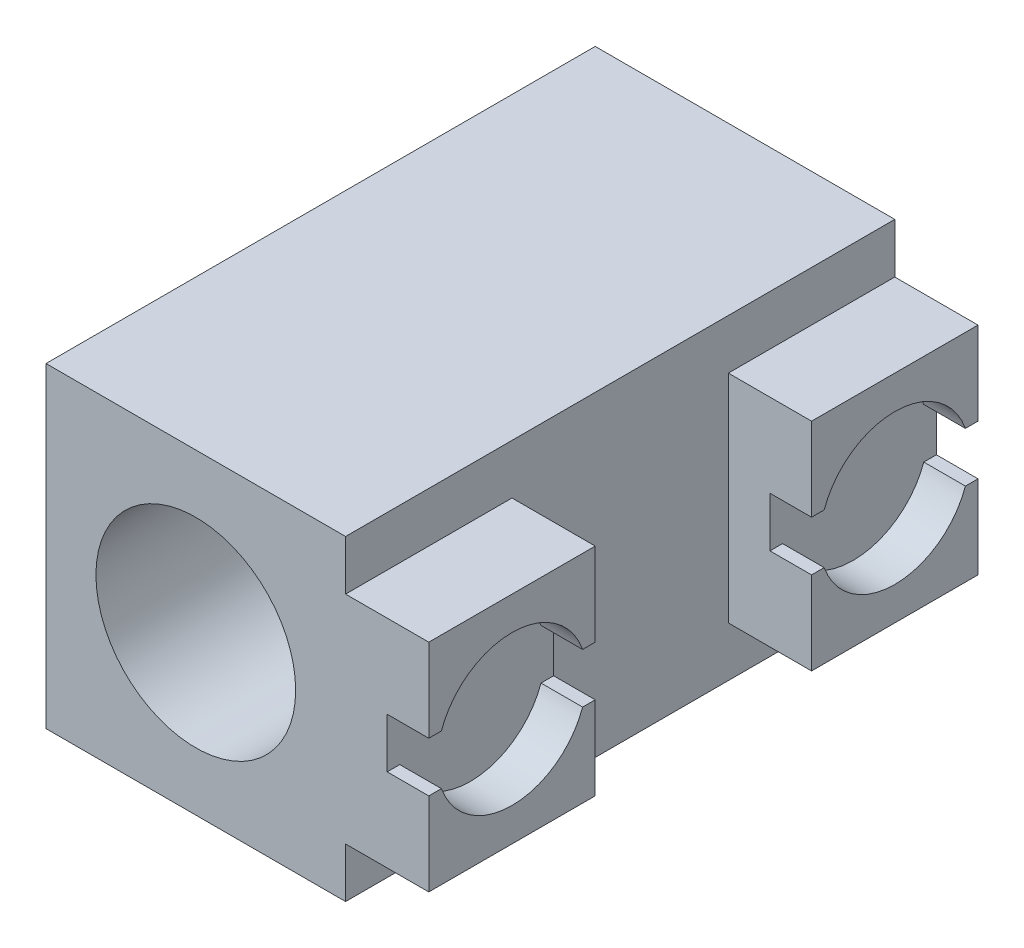
ISO-10303-21;
HEADER;
FILE_DESCRIPTION(('STEP AP214'),'2;1');
FILE_NAME('part.step','',(''),(''),'','','');
FILE_SCHEMA(('AUTOMOTIVE_DESIGN { 1 0 10303 214 1 1 1 1 }'));
ENDSEC;
DATA;
#1=APPLICATION_CONTEXT('core data for automotive mechanical design processes');
#2=APPLICATION_PROTOCOL_DEFINITION('international standard','automotive_design',2000,#1);
#3=PRODUCT_CONTEXT('',#1,'mechanical');
#4=PRODUCT('Part','Part','',(#3));
#5=PRODUCT_RELATED_PRODUCT_CATEGORY('part','',(#4));
#6=PRODUCT_DEFINITION_FORMATION('','',#4);
#7=PRODUCT_DEFINITION_CONTEXT('part definition',#1,'design');
#8=PRODUCT_DEFINITION('design','',#6,#7);
#9=PRODUCT_DEFINITION_SHAPE('','',#8);
#10=(LENGTH_UNIT() NAMED_UNIT(*) SI_UNIT(.MILLI.,.METRE.));
#11=(NAMED_UNIT(*) PLANE_ANGLE_UNIT() SI_UNIT($,.RADIAN.));
#12=(NAMED_UNIT(*) SI_UNIT($,.STERADIAN.) SOLID_ANGLE_UNIT());
#13=UNCERTAINTY_MEASURE_WITH_UNIT(LENGTH_MEASURE(1.E-05),#10,'distance_accuracy_value','');
#14=(GEOMETRIC_REPRESENTATION_CONTEXT(3) GLOBAL_UNCERTAINTY_ASSIGNED_CONTEXT((#13)) GLOBAL_UNIT_ASSIGNED_CONTEXT((#10,
#11,#12)) REPRESENTATION_CONTEXT('',''));
#15=CARTESIAN_POINT('',(0.,0.,0.));
#16=DIRECTION('',(0.,0.,1.));
#17=DIRECTION('',(1.,0.,0.));
#18=AXIS2_PLACEMENT_3D('',#15,#16,#17);
#19=CARTESIAN_POINT('',(46.,0.,0.));
#20=DIRECTION('',(-1.,0.,0.));
#21=DIRECTION('',(0.,-1.,0.));
#22=AXIS2_PLACEMENT_3D('',#19,#20,#21);
#23=PLANE('',#22);
#24=DIRECTION('',(0.,1.,0.));
#25=VECTOR('',#24,1.);
#26=CARTESIAN_POINT('',(46.,32.,13.));
#27=LINE('',#26,#25);
#28=CARTESIAN_POINT('',(46.,6.00000000000001,13.));
#29=VERTEX_POINT('',#28);
#30=CARTESIAN_POINT('',(46.,16.,13.));
#31=VERTEX_POINT('',#30);
#32=EDGE_CURVE('E265',#29,#31,#27,.T.);
#33=ORIENTED_EDGE('',*,*,#32,.T.);
#34=DIRECTION('',(0.,0.,1.));
#35=VECTOR('',#34,1.);
#36=CARTESIAN_POINT('',(46.,16.,-33.));
#37=LINE('',#36,#35);
#38=CARTESIAN_POINT('',(46.,16.,14.5147186257614));
#39=VERTEX_POINT('',#38);
#40=EDGE_CURVE('E508',#31,#39,#37,.T.);
#41=ORIENTED_EDGE('',*,*,#40,.T.);
#42=CARTESIAN_POINT('',(46.,19.,23.));
#43=DIRECTION('',(1.,0.,0.));
#44=DIRECTION('',(0.,1.,0.));
#45=AXIS2_PLACEMENT_3D('',#42,#43,#44);
#46=CIRCLE('',#45,9.);
#47=CARTESIAN_POINT('',(46.,16.,31.4852813742386));
#48=VERTEX_POINT('',#47);
#49=EDGE_CURVE('E476',#48,#39,#46,.T.);
#50=ORIENTED_EDGE('',*,*,#49,.F.);
#51=CARTESIAN_POINT('',(46.,16.,33.));
#52=VERTEX_POINT('',#51);
#53=EDGE_CURVE('E427',#48,#52,#37,.T.);
#54=ORIENTED_EDGE('',*,*,#53,.T.);
#55=DIRECTION('',(0.,-1.,0.));
#56=VECTOR('',#55,1.);
#57=CARTESIAN_POINT('',(46.,6.,33.));
#58=LINE('',#57,#56);
#59=CARTESIAN_POINT('',(46.,6.,33.));
#60=VERTEX_POINT('',#59);
#61=EDGE_CURVE('E262',#52,#60,#58,.T.);
#62=ORIENTED_EDGE('',*,*,#61,.T.);
#63=DIRECTION('',(0.,0.,-1.));
#64=VECTOR('',#63,1.);
#65=CARTESIAN_POINT('',(46.,6.00000000000001,13.));
#66=LINE('',#65,#64);
#67=EDGE_CURVE('E261',#60,#29,#66,.T.);
#68=ORIENTED_EDGE('',*,*,#67,.T.);
#69=EDGE_LOOP('',(#33,#41,#50,#54,#62,#68));
#70=FACE_BOUND('',#69,.T.);
#71=ADVANCED_FACE('F37',(#70),#23,.F.);
#72=CARTESIAN_POINT('',(46.,0.,0.));
#73=DIRECTION('',(1.,0.,0.));
#74=DIRECTION('',(0.,1.,0.));
#75=AXIS2_PLACEMENT_3D('',#72,#73,#74);
#76=PLANE('',#75);
#77=CARTESIAN_POINT('',(46.,16.,-14.5147186257614));
#78=VERTEX_POINT('',#77);
#79=CARTESIAN_POINT('',(46.,16.,-13.));
#80=VERTEX_POINT('',#79);
#81=EDGE_CURVE('E363',#78,#80,#37,.T.);
#82=ORIENTED_EDGE('',*,*,#81,.T.);
#83=DIRECTION('',(0.,-1.,0.));
#84=VECTOR('',#83,1.);
#85=CARTESIAN_POINT('',(46.,32.,-13.));
#86=LINE('',#85,#84);
#87=CARTESIAN_POINT('',(46.,6.00000000000001,-13.));
#88=VERTEX_POINT('',#87);
#89=EDGE_CURVE('E343',#80,#88,#86,.T.);
#90=ORIENTED_EDGE('',*,*,#89,.T.);
#91=DIRECTION('',(0.,0.,-1.));
#92=VECTOR('',#91,1.);
#93=CARTESIAN_POINT('',(46.,6.00000000000001,-13.));
#94=LINE('',#93,#92);
#95=CARTESIAN_POINT('',(46.,6.00000000000001,-33.));
#96=VERTEX_POINT('',#95);
#97=EDGE_CURVE('E340',#88,#96,#94,.T.);
#98=ORIENTED_EDGE('',*,*,#97,.T.);
#99=DIRECTION('',(0.,1.,0.));
#100=VECTOR('',#99,1.);
#101=CARTESIAN_POINT('',(46.,6.00000000000001,-33.));
#102=LINE('',#101,#100);
#103=CARTESIAN_POINT('',(46.,16.,-33.));
#104=VERTEX_POINT('',#103);
#105=EDGE_CURVE('E249',#96,#104,#102,.T.);
#106=ORIENTED_EDGE('',*,*,#105,.T.);
#107=CARTESIAN_POINT('',(46.,16.,-31.4852813742386));
#108=VERTEX_POINT('',#107);
#109=EDGE_CURVE('E423',#104,#108,#37,.T.);
#110=ORIENTED_EDGE('',*,*,#109,.T.);
#111=CARTESIAN_POINT('',(46.,19.,-23.));
#112=DIRECTION('',(1.,0.,0.));
#113=DIRECTION('',(0.,1.,0.));
#114=AXIS2_PLACEMENT_3D('',#111,#112,#113);
#115=CIRCLE('',#114,9.);
#116=EDGE_CURVE('E479',#78,#108,#115,.T.);
#117=ORIENTED_EDGE('',*,*,#116,.F.);
#118=EDGE_LOOP('',(#82,#90,#98,#106,#110,#117));
#119=FACE_BOUND('',#118,.T.);
#120=ADVANCED_FACE('F361',(#119),#76,.T.);
#121=CARTESIAN_POINT('',(41.,19.,-23.));
#122=DIRECTION('',(1.,0.,0.));
#123=DIRECTION('',(0.,1.,0.));
#124=AXIS2_PLACEMENT_3D('',#121,#122,#123);
#125=CYLINDRICAL_SURFACE('',#124,9.);
#126=ORIENTED_EDGE('',*,*,#116,.T.);
#127=DIRECTION('',(1.,0.,0.));
#128=VECTOR('',#127,1.);
#129=CARTESIAN_POINT('',(41.,16.,-31.4852813742386));
#130=LINE('',#129,#128);
#131=CARTESIAN_POINT('',(41.,16.,-31.4852813742386));
#132=VERTEX_POINT('',#131);
#133=EDGE_CURVE('E457',#108,#132,#130,.F.);
#134=ORIENTED_EDGE('',*,*,#133,.T.);
#135=CARTESIAN_POINT('',(41.,19.,-23.));
#136=DIRECTION('',(1.,0.,0.));
#137=DIRECTION('',(0.,1.,0.));
#138=AXIS2_PLACEMENT_3D('',#135,#136,#137);
#139=CIRCLE('',#138,9.);
#140=CARTESIAN_POINT('',(41.,16.,-14.5147186257614));
#141=VERTEX_POINT('',#140);
#142=EDGE_CURVE('E481',#141,#132,#139,.T.);
#143=ORIENTED_EDGE('',*,*,#142,.F.);
#144=DIRECTION('',(1.,0.,0.));
#145=VECTOR('',#144,1.);
#146=CARTESIAN_POINT('',(41.,16.,-14.5147186257614));
#147=LINE('',#146,#145);
#148=EDGE_CURVE('E454',#141,#78,#147,.T.);
#149=ORIENTED_EDGE('',*,*,#148,.T.);
#150=EDGE_LOOP('',(#126,#134,#143,#149));
#151=FACE_BOUND('',#150,.T.);
#152=ADVANCED_FACE('F386',(#151),#125,.F.);
#153=CARTESIAN_POINT('',(41.,19.,23.));
#154=DIRECTION('',(1.,0.,0.));
#155=DIRECTION('',(0.,1.,0.));
#156=AXIS2_PLACEMENT_3D('',#153,#154,#155);
#157=CYLINDRICAL_SURFACE('',#156,9.);
#158=ORIENTED_EDGE('',*,*,#49,.T.);
#159=DIRECTION('',(1.,0.,0.));
#160=VECTOR('',#159,1.);
#161=CARTESIAN_POINT('',(41.,16.,14.5147186257614));
#162=LINE('',#161,#160);
#163=CARTESIAN_POINT('',(41.,16.,14.5147186257614));
#164=VERTEX_POINT('',#163);
#165=EDGE_CURVE('E451',#39,#164,#162,.F.);
#166=ORIENTED_EDGE('',*,*,#165,.T.);
#167=CARTESIAN_POINT('',(41.,19.,23.));
#168=DIRECTION('',(1.,0.,0.));
#169=DIRECTION('',(0.,1.,0.));
#170=AXIS2_PLACEMENT_3D('',#167,#168,#169);
#171=CIRCLE('',#170,9.);
#172=CARTESIAN_POINT('',(41.,16.,31.4852813742386));
#173=VERTEX_POINT('',#172);
#174=EDGE_CURVE('E475',#173,#164,#171,.T.);
#175=ORIENTED_EDGE('',*,*,#174,.F.);
#176=DIRECTION('',(1.,0.,0.));
#177=VECTOR('',#176,1.);
#178=CARTESIAN_POINT('',(41.,16.,31.4852813742386));
#179=LINE('',#178,#177);
#180=EDGE_CURVE('E448',#173,#48,#179,.T.);
#181=ORIENTED_EDGE('',*,*,#180,.T.);
#182=EDGE_LOOP('',(#158,#166,#175,#181));
#183=FACE_BOUND('',#182,.T.);
#184=ADVANCED_FACE('F511',(#183),#157,.F.);
#185=CARTESIAN_POINT('',(36.,0.,33.));
#186=DIRECTION('',(-1.,0.,0.));
#187=DIRECTION('',(0.,-1.,0.));
#188=AXIS2_PLACEMENT_3D('',#185,#186,#187);
#189=PLANE('',#188);
#190=DIRECTION('',(0.,0.,1.));
#191=VECTOR('',#190,1.);
#192=CARTESIAN_POINT('',(36.,32.,-33.));
#193=LINE('',#192,#191);
#194=CARTESIAN_POINT('',(36.,32.,-33.));
#195=VERTEX_POINT('',#194);
#196=CARTESIAN_POINT('',(36.,32.,-13.));
#197=VERTEX_POINT('',#196);
#198=EDGE_CURVE('E275',#195,#197,#193,.T.);
#199=ORIENTED_EDGE('',*,*,#198,.F.);
#200=DIRECTION('',(0.,1.,0.));
#201=VECTOR('',#200,1.);
#202=CARTESIAN_POINT('',(36.,0.,-33.));
#203=LINE('',#202,#201);
#204=CARTESIAN_POINT('',(36.,38.,-33.));
#205=VERTEX_POINT('',#204);
#206=EDGE_CURVE('E316',#195,#205,#203,.T.);
#207=ORIENTED_EDGE('',*,*,#206,.T.);
#208=DIRECTION('',(0.,0.,-1.));
#209=VECTOR('',#208,1.);
#210=CARTESIAN_POINT('',(36.,38.,33.));
#211=LINE('',#210,#209);
#212=CARTESIAN_POINT('',(36.,38.,33.));
#213=VERTEX_POINT('',#212);
#214=EDGE_CURVE('E322',#213,#205,#211,.T.);
#215=ORIENTED_EDGE('',*,*,#214,.F.);
#216=DIRECTION('',(0.,1.,0.));
#217=VECTOR('',#216,1.);
#218=CARTESIAN_POINT('',(36.,0.,33.));
#219=LINE('',#218,#217);
#220=CARTESIAN_POINT('',(36.,32.,33.));
#221=VERTEX_POINT('',#220);
#222=EDGE_CURVE('E305',#221,#213,#219,.T.);
#223=ORIENTED_EDGE('',*,*,#222,.F.);
#224=DIRECTION('',(0.,0.,1.));
#225=VECTOR('',#224,1.);
#226=CARTESIAN_POINT('',(36.,32.,33.));
#227=LINE('',#226,#225);
#228=CARTESIAN_POINT('',(36.,32.,13.));
#229=VERTEX_POINT('',#228);
#230=EDGE_CURVE('E278',#229,#221,#227,.T.);
#231=ORIENTED_EDGE('',*,*,#230,.F.);
#232=DIRECTION('',(0.,1.,0.));
#233=VECTOR('',#232,1.);
#234=CARTESIAN_POINT('',(36.,32.,13.));
#235=LINE('',#234,#233);
#236=CARTESIAN_POINT('',(36.,6.00000000000001,13.));
#237=VERTEX_POINT('',#236);
#238=EDGE_CURVE('E274',#237,#229,#235,.T.);
#239=ORIENTED_EDGE('',*,*,#238,.F.);
#240=DIRECTION('',(0.,0.,-1.));
#241=VECTOR('',#240,1.);
#242=CARTESIAN_POINT('',(36.,6.00000000000001,13.));
#243=LINE('',#242,#241);
#244=CARTESIAN_POINT('',(36.,6.,33.));
#245=VERTEX_POINT('',#244);
#246=EDGE_CURVE('E271',#245,#237,#243,.T.);
#247=ORIENTED_EDGE('',*,*,#246,.F.);
#248=CARTESIAN_POINT('',(36.,0.,33.));
#249=VERTEX_POINT('',#248);
#250=EDGE_CURVE('E306',#249,#245,#219,.T.);
#251=ORIENTED_EDGE('',*,*,#250,.F.);
#252=DIRECTION('',(0.,0.,-1.));
#253=VECTOR('',#252,1.);
#254=CARTESIAN_POINT('',(36.,0.,33.));
#255=LINE('',#254,#253);
#256=CARTESIAN_POINT('',(36.,0.,-33.));
#257=VERTEX_POINT('',#256);
#258=EDGE_CURVE('E45',#249,#257,#255,.T.);
#259=ORIENTED_EDGE('',*,*,#258,.T.);
#260=CARTESIAN_POINT('',(36.,6.00000000000001,-33.));
#261=VERTEX_POINT('',#260);
#262=EDGE_CURVE('E317',#257,#261,#203,.T.);
#263=ORIENTED_EDGE('',*,*,#262,.T.);
#264=DIRECTION('',(0.,0.,-1.));
#265=VECTOR('',#264,1.);
#266=CARTESIAN_POINT('',(36.,6.00000000000001,-13.));
#267=LINE('',#266,#265);
#268=CARTESIAN_POINT('',(36.,6.00000000000001,-13.));
#269=VERTEX_POINT('',#268);
#270=EDGE_CURVE('E253',#269,#261,#267,.T.);
#271=ORIENTED_EDGE('',*,*,#270,.F.);
#272=DIRECTION('',(0.,-1.,0.));
#273=VECTOR('',#272,1.);
#274=CARTESIAN_POINT('',(36.,32.,-13.));
#275=LINE('',#274,#273);
#276=EDGE_CURVE('E351',#197,#269,#275,.T.);
#277=ORIENTED_EDGE('',*,*,#276,.F.);
#278=EDGE_LOOP('',(#199,#207,#215,#223,#231,#239,#247,#251,#259,#263,#271,#277));
#279=FACE_BOUND('',#278,.T.);
#280=ADVANCED_FACE('F330',(#279),#189,.F.);
#281=CARTESIAN_POINT('',(0.,0.,33.));
#282=DIRECTION('',(1.,0.,0.));
#283=DIRECTION('',(0.,0.,-1.));
#284=AXIS2_PLACEMENT_3D('',#281,#282,#283);
#285=PLANE('',#284);
#286=DIRECTION('',(0.,-1.,0.));
#287=VECTOR('',#286,1.);
#288=CARTESIAN_POINT('',(0.,0.,-33.));
#289=LINE('',#288,#287);
#290=CARTESIAN_POINT('',(0.,38.,-33.));
#291=VERTEX_POINT('',#290);
#292=CARTESIAN_POINT('',(0.,0.,-33.));
#293=VERTEX_POINT('',#292);
#294=EDGE_CURVE('E296',#291,#293,#289,.T.);
#295=ORIENTED_EDGE('',*,*,#294,.T.);
#296=DIRECTION('',(0.,0.,-1.));
#297=VECTOR('',#296,1.);
#298=CARTESIAN_POINT('',(0.,0.,33.));
#299=LINE('',#298,#297);
#300=CARTESIAN_POINT('',(0.,0.,33.));
#301=VERTEX_POINT('',#300);
#302=EDGE_CURVE('E11',#301,#293,#299,.T.);
#303=ORIENTED_EDGE('',*,*,#302,.F.);
#304=DIRECTION('',(0.,-1.,0.));
#305=VECTOR('',#304,1.);
#306=CARTESIAN_POINT('',(0.,0.,33.));
#307=LINE('',#306,#305);
#308=CARTESIAN_POINT('',(0.,38.,33.));
#309=VERTEX_POINT('',#308);
#310=EDGE_CURVE('E299',#309,#301,#307,.T.);
#311=ORIENTED_EDGE('',*,*,#310,.F.);
#312=DIRECTION('',(0.,0.,-1.));
#313=VECTOR('',#312,1.);
#314=CARTESIAN_POINT('',(0.,38.,33.));
#315=LINE('',#314,#313);
#316=EDGE_CURVE('E311',#309,#291,#315,.T.);
#317=ORIENTED_EDGE('',*,*,#316,.T.);
#318=EDGE_LOOP('',(#295,#303,#311,#317));
#319=FACE_BOUND('',#318,.T.);
#320=ADVANCED_FACE('F39',(#319),#285,.F.);
#321=CARTESIAN_POINT('',(0.,0.,33.));
#322=DIRECTION('',(0.,1.,0.));
#323=DIRECTION('',(0.,0.,1.));
#324=AXIS2_PLACEMENT_3D('',#321,#322,#323);
#325=PLANE('',#324);
#326=DIRECTION('',(1.,0.,0.));
#327=VECTOR('',#326,1.);
#328=CARTESIAN_POINT('',(0.,0.,-33.));
#329=LINE('',#328,#327);
#330=EDGE_CURVE('E314',#293,#257,#329,.T.);
#331=ORIENTED_EDGE('',*,*,#330,.T.);
#332=ORIENTED_EDGE('',*,*,#258,.F.);
#333=DIRECTION('',(1.,0.,0.));
#334=VECTOR('',#333,1.);
#335=CARTESIAN_POINT('',(0.,0.,33.));
#336=LINE('',#335,#334);
#337=EDGE_CURVE('E302',#301,#249,#336,.T.);
#338=ORIENTED_EDGE('',*,*,#337,.F.);
#339=ORIENTED_EDGE('',*,*,#302,.T.);
#340=EDGE_LOOP('',(#331,#332,#338,#339));
#341=FACE_BOUND('',#340,.T.);
#342=ADVANCED_FACE('F770',(#341),#325,.F.);
#343=CARTESIAN_POINT('',(0.,38.,33.));
#344=DIRECTION('',(0.,-1.,0.));
#345=DIRECTION('',(0.,0.,-1.));
#346=AXIS2_PLACEMENT_3D('',#343,#344,#345);
#347=PLANE('',#346);
#348=DIRECTION('',(-1.,0.,0.));
#349=VECTOR('',#348,1.);
#350=CARTESIAN_POINT('',(0.,38.,-33.));
#351=LINE('',#350,#349);
#352=EDGE_CURVE('E303',#205,#291,#351,.T.);
#353=ORIENTED_EDGE('',*,*,#352,.T.);
#354=ORIENTED_EDGE('',*,*,#316,.F.);
#355=DIRECTION('',(-1.,0.,0.));
#356=VECTOR('',#355,1.);
#357=CARTESIAN_POINT('',(0.,38.,33.));
#358=LINE('',#357,#356);
#359=EDGE_CURVE('E309',#213,#309,#358,.T.);
#360=ORIENTED_EDGE('',*,*,#359,.F.);
#361=ORIENTED_EDGE('',*,*,#214,.T.);
#362=EDGE_LOOP('',(#353,#354,#360,#361));
#363=FACE_BOUND('',#362,.T.);
#364=ADVANCED_FACE('F489',(#363),#347,.F.);
#365=CARTESIAN_POINT('',(0.,0.,33.));
#366=DIRECTION('',(0.,0.,-1.));
#367=DIRECTION('',(-1.,0.,0.));
#368=AXIS2_PLACEMENT_3D('',#365,#366,#367);
#369=PLANE('',#368);
#370=CARTESIAN_POINT('',(18.,19.,33.));
#371=DIRECTION('',(0.,0.,1.));
#372=DIRECTION('',(1.,0.,0.));
#373=AXIS2_PLACEMENT_3D('',#370,#371,#372);
#374=CIRCLE('',#373,12.);
#375=CARTESIAN_POINT('',(30.,19.,33.));
#376=VERTEX_POINT('',#375);
#377=EDGE_CURVE('E292',#376,#376,#374,.T.);
#378=ORIENTED_EDGE('',*,*,#377,.F.);
#379=EDGE_LOOP('',(#378));
#380=FACE_BOUND('',#379,.T.);
#381=ORIENTED_EDGE('',*,*,#61,.F.);
#382=DIRECTION('',(1.,0.,0.));
#383=VECTOR('',#382,1.);
#384=CARTESIAN_POINT('',(41.,16.,33.));
#385=LINE('',#384,#383);
#386=CARTESIAN_POINT('',(41.,16.,33.));
#387=VERTEX_POINT('',#386);
#388=EDGE_CURVE('E229',#387,#52,#385,.T.);
#389=ORIENTED_EDGE('',*,*,#388,.F.);
#390=DIRECTION('',(0.,-1.,0.));
#391=VECTOR('',#390,1.);
#392=CARTESIAN_POINT('',(41.,22.,33.));
#393=LINE('',#392,#391);
#394=CARTESIAN_POINT('',(41.,22.,33.));
#395=VERTEX_POINT('',#394);
#396=EDGE_CURVE('E414',#395,#387,#393,.T.);
#397=ORIENTED_EDGE('',*,*,#396,.F.);
#398=DIRECTION('',(-1.,0.,0.));
#399=VECTOR('',#398,1.);
#400=CARTESIAN_POINT('',(46.,22.,33.));
#401=LINE('',#400,#399);
#402=CARTESIAN_POINT('',(46.,22.,33.));
#403=VERTEX_POINT('',#402);
#404=EDGE_CURVE('E411',#403,#395,#401,.T.);
#405=ORIENTED_EDGE('',*,*,#404,.F.);
#406=CARTESIAN_POINT('',(46.,32.,33.));
#407=VERTEX_POINT('',#406);
#408=EDGE_CURVE('E258',#407,#403,#58,.T.);
#409=ORIENTED_EDGE('',*,*,#408,.F.);
#410=DIRECTION('',(-1.,0.,0.));
#411=VECTOR('',#410,1.);
#412=CARTESIAN_POINT('',(46.,32.,33.));
#413=LINE('',#412,#411);
#414=EDGE_CURVE('E270',#407,#221,#413,.T.);
#415=ORIENTED_EDGE('',*,*,#414,.T.);
#416=ORIENTED_EDGE('',*,*,#222,.T.);
#417=ORIENTED_EDGE('',*,*,#359,.T.);
#418=ORIENTED_EDGE('',*,*,#310,.T.);
#419=ORIENTED_EDGE('',*,*,#337,.T.);
#420=ORIENTED_EDGE('',*,*,#250,.T.);
#421=DIRECTION('',(-1.,0.,0.));
#422=VECTOR('',#421,1.);
#423=CARTESIAN_POINT('',(46.,6.,33.));
#424=LINE('',#423,#422);
#425=EDGE_CURVE('E289',#60,#245,#424,.T.);
#426=ORIENTED_EDGE('',*,*,#425,.F.);
#427=EDGE_LOOP('',(#381,#389,#397,#405,#409,#415,#416,#417,#418,#419,#420,#426));
#428=FACE_BOUND('',#427,.T.);
#429=ADVANCED_FACE('F408',(#380,#428),#369,.F.);
#430=CARTESIAN_POINT('',(0.,0.,-33.));
#431=DIRECTION('',(0.,0.,-1.));
#432=DIRECTION('',(-1.,0.,0.));
#433=AXIS2_PLACEMENT_3D('',#430,#431,#432);
#434=PLANE('',#433);
#435=DIRECTION('',(1.,0.,0.));
#436=VECTOR('',#435,1.);
#437=CARTESIAN_POINT('',(41.,16.,-33.));
#438=LINE('',#437,#436);
#439=CARTESIAN_POINT('',(41.,16.,-33.));
#440=VERTEX_POINT('',#439);
#441=EDGE_CURVE('E419',#440,#104,#438,.T.);
#442=ORIENTED_EDGE('',*,*,#441,.T.);
#443=ORIENTED_EDGE('',*,*,#105,.F.);
#444=DIRECTION('',(-1.,0.,0.));
#445=VECTOR('',#444,1.);
#446=CARTESIAN_POINT('',(46.,6.00000000000001,-33.));
#447=LINE('',#446,#445);
#448=EDGE_CURVE('E337',#96,#261,#447,.T.);
#449=ORIENTED_EDGE('',*,*,#448,.T.);
#450=ORIENTED_EDGE('',*,*,#262,.F.);
#451=ORIENTED_EDGE('',*,*,#330,.F.);
#452=ORIENTED_EDGE('',*,*,#294,.F.);
#453=ORIENTED_EDGE('',*,*,#352,.F.);
#454=ORIENTED_EDGE('',*,*,#206,.F.);
#455=DIRECTION('',(-1.,0.,0.));
#456=VECTOR('',#455,1.);
#457=CARTESIAN_POINT('',(46.,32.,-33.));
#458=LINE('',#457,#456);
#459=CARTESIAN_POINT('',(46.,32.,-33.));
#460=VERTEX_POINT('',#459);
#461=EDGE_CURVE('E248',#460,#195,#458,.T.);
#462=ORIENTED_EDGE('',*,*,#461,.F.);
#463=CARTESIAN_POINT('',(46.,22.,-33.));
#464=VERTEX_POINT('',#463);
#465=EDGE_CURVE('E234',#464,#460,#102,.T.);
#466=ORIENTED_EDGE('',*,*,#465,.F.);
#467=DIRECTION('',(-1.,0.,0.));
#468=VECTOR('',#467,1.);
#469=CARTESIAN_POINT('',(46.,22.,-33.));
#470=LINE('',#469,#468);
#471=CARTESIAN_POINT('',(41.,22.,-33.));
#472=VERTEX_POINT('',#471);
#473=EDGE_CURVE('E220',#464,#472,#470,.T.);
#474=ORIENTED_EDGE('',*,*,#473,.T.);
#475=DIRECTION('',(0.,-1.,0.));
#476=VECTOR('',#475,1.);
#477=CARTESIAN_POINT('',(41.,22.,-33.));
#478=LINE('',#477,#476);
#479=EDGE_CURVE('E228',#472,#440,#478,.T.);
#480=ORIENTED_EDGE('',*,*,#479,.T.);
#481=EDGE_LOOP('',(#442,#443,#449,#450,#451,#452,#453,#454,#462,#466,#474,#480));
#482=FACE_BOUND('',#481,.T.);
#483=CARTESIAN_POINT('',(18.,19.,-33.));
#484=DIRECTION('',(0.,0.,1.));
#485=DIRECTION('',(1.,0.,0.));
#486=AXIS2_PLACEMENT_3D('',#483,#484,#485);
#487=CIRCLE('',#486,12.);
#488=CARTESIAN_POINT('',(30.,19.,-33.));
#489=VERTEX_POINT('',#488);
#490=EDGE_CURVE('E293',#489,#489,#487,.T.);
#491=ORIENTED_EDGE('',*,*,#490,.T.);
#492=EDGE_LOOP('',(#491));
#493=FACE_BOUND('',#492,.T.);
#494=ADVANCED_FACE('F245',(#482,#493),#434,.T.);
#495=CARTESIAN_POINT('',(18.,19.,-33.));
#496=DIRECTION('',(0.,0.,1.));
#497=DIRECTION('',(1.,0.,0.));
#498=AXIS2_PLACEMENT_3D('',#495,#496,#497);
#499=CYLINDRICAL_SURFACE('',#498,12.);
#500=ORIENTED_EDGE('',*,*,#490,.F.);
#501=EDGE_LOOP('',(#500));
#502=FACE_BOUND('',#501,.T.);
#503=ORIENTED_EDGE('',*,*,#377,.T.);
#504=EDGE_LOOP('',(#503));
#505=FACE_BOUND('',#504,.T.);
#506=ADVANCED_FACE('F727',(#502,#505),#499,.F.);
#507=CARTESIAN_POINT('',(46.,6.00000000000001,13.));
#508=DIRECTION('',(0.,1.,0.));
#509=DIRECTION('',(0.,0.,1.));
#510=AXIS2_PLACEMENT_3D('',#507,#508,#509);
#511=PLANE('',#510);
#512=ORIENTED_EDGE('',*,*,#246,.T.);
#513=DIRECTION('',(-1.,0.,0.));
#514=VECTOR('',#513,1.);
#515=CARTESIAN_POINT('',(46.,6.00000000000001,13.));
#516=LINE('',#515,#514);
#517=EDGE_CURVE('E286',#29,#237,#516,.T.);
#518=ORIENTED_EDGE('',*,*,#517,.F.);
#519=ORIENTED_EDGE('',*,*,#67,.F.);
#520=ORIENTED_EDGE('',*,*,#425,.T.);
#521=EDGE_LOOP('',(#512,#518,#519,#520));
#522=FACE_BOUND('',#521,.T.);
#523=ADVANCED_FACE('F500',(#522),#511,.F.);
#524=CARTESIAN_POINT('',(46.,32.,13.));
#525=DIRECTION('',(0.,0.,1.));
#526=DIRECTION('',(0.,-1.,0.));
#527=AXIS2_PLACEMENT_3D('',#524,#525,#526);
#528=PLANE('',#527);
#529=DIRECTION('',(0.,-1.,0.));
#530=VECTOR('',#529,1.);
#531=CARTESIAN_POINT('',(41.,32.,13.));
#532=LINE('',#531,#530);
#533=CARTESIAN_POINT('',(41.,22.,13.));
#534=VERTEX_POINT('',#533);
#535=CARTESIAN_POINT('',(41.,16.,13.));
#536=VERTEX_POINT('',#535);
#537=EDGE_CURVE('E468',#534,#536,#532,.T.);
#538=ORIENTED_EDGE('',*,*,#537,.T.);
#539=DIRECTION('',(1.,0.,0.));
#540=VECTOR('',#539,1.);
#541=CARTESIAN_POINT('',(46.,16.,13.));
#542=LINE('',#541,#540);
#543=EDGE_CURVE('E462',#536,#31,#542,.T.);
#544=ORIENTED_EDGE('',*,*,#543,.T.);
#545=ORIENTED_EDGE('',*,*,#32,.F.);
#546=ORIENTED_EDGE('',*,*,#517,.T.);
#547=ORIENTED_EDGE('',*,*,#238,.T.);
#548=DIRECTION('',(-1.,0.,0.));
#549=VECTOR('',#548,1.);
#550=CARTESIAN_POINT('',(46.,32.,13.));
#551=LINE('',#550,#549);
#552=CARTESIAN_POINT('',(46.,32.,13.));
#553=VERTEX_POINT('',#552);
#554=EDGE_CURVE('E283',#553,#229,#551,.T.);
#555=ORIENTED_EDGE('',*,*,#554,.F.);
#556=CARTESIAN_POINT('',(46.,22.,13.));
#557=VERTEX_POINT('',#556);
#558=EDGE_CURVE('E264',#557,#553,#27,.T.);
#559=ORIENTED_EDGE('',*,*,#558,.F.);
#560=DIRECTION('',(-1.,0.,0.));
#561=VECTOR('',#560,1.);
#562=CARTESIAN_POINT('',(46.,22.,13.));
#563=LINE('',#562,#561);
#564=EDGE_CURVE('E445',#557,#534,#563,.T.);
#565=ORIENTED_EDGE('',*,*,#564,.T.);
#566=EDGE_LOOP('',(#538,#544,#545,#546,#547,#555,#559,#565));
#567=FACE_BOUND('',#566,.T.);
#568=ADVANCED_FACE('F397',(#567),#528,.F.);
#569=CARTESIAN_POINT('',(46.,32.,33.));
#570=DIRECTION('',(0.,-1.,0.));
#571=DIRECTION('',(1.,0.,0.));
#572=AXIS2_PLACEMENT_3D('',#569,#570,#571);
#573=PLANE('',#572);
#574=ORIENTED_EDGE('',*,*,#230,.T.);
#575=ORIENTED_EDGE('',*,*,#414,.F.);
#576=DIRECTION('',(0.,0.,1.));
#577=VECTOR('',#576,1.);
#578=CARTESIAN_POINT('',(46.,32.,33.));
#579=LINE('',#578,#577);
#580=EDGE_CURVE('E268',#553,#407,#579,.T.);
#581=ORIENTED_EDGE('',*,*,#580,.F.);
#582=ORIENTED_EDGE('',*,*,#554,.T.);
#583=EDGE_LOOP('',(#574,#575,#581,#582));
#584=FACE_BOUND('',#583,.T.);
#585=ADVANCED_FACE('F389',(#584),#573,.F.);
#586=ORIENTED_EDGE('',*,*,#408,.T.);
#587=DIRECTION('',(0.,0.,1.));
#588=VECTOR('',#587,1.);
#589=CARTESIAN_POINT('',(46.,22.,-33.));
#590=LINE('',#589,#588);
#591=CARTESIAN_POINT('',(46.,22.,31.4852813742386));
#592=VERTEX_POINT('',#591);
#593=EDGE_CURVE('E242',#592,#403,#590,.T.);
#594=ORIENTED_EDGE('',*,*,#593,.F.);
#595=CARTESIAN_POINT('',(46.,22.,14.5147186257614));
#596=VERTEX_POINT('',#595);
#597=EDGE_CURVE('E477',#596,#592,#46,.T.);
#598=ORIENTED_EDGE('',*,*,#597,.F.);
#599=EDGE_CURVE('E537',#557,#596,#590,.T.);
#600=ORIENTED_EDGE('',*,*,#599,.F.);
#601=ORIENTED_EDGE('',*,*,#558,.T.);
#602=ORIENTED_EDGE('',*,*,#580,.T.);
#603=EDGE_LOOP('',(#586,#594,#598,#600,#601,#602));
#604=FACE_BOUND('',#603,.T.);
#605=ADVANCED_FACE('F382',(#604),#23,.F.);
#606=CARTESIAN_POINT('',(46.,32.,-33.));
#607=DIRECTION('',(0.,-1.,0.));
#608=DIRECTION('',(1.,0.,0.));
#609=AXIS2_PLACEMENT_3D('',#606,#607,#608);
#610=PLANE('',#609);
#611=ORIENTED_EDGE('',*,*,#198,.T.);
#612=DIRECTION('',(-1.,0.,0.));
#613=VECTOR('',#612,1.);
#614=CARTESIAN_POINT('',(46.,32.,-13.));
#615=LINE('',#614,#613);
#616=CARTESIAN_POINT('',(46.,32.,-13.));
#617=VERTEX_POINT('',#616);
#618=EDGE_CURVE('E346',#617,#197,#615,.T.);
#619=ORIENTED_EDGE('',*,*,#618,.F.);
#620=DIRECTION('',(0.,0.,1.));
#621=VECTOR('',#620,1.);
#622=CARTESIAN_POINT('',(46.,32.,-33.));
#623=LINE('',#622,#621);
#624=EDGE_CURVE('E250',#460,#617,#623,.T.);
#625=ORIENTED_EDGE('',*,*,#624,.F.);
#626=ORIENTED_EDGE('',*,*,#461,.T.);
#627=EDGE_LOOP('',(#611,#619,#625,#626));
#628=FACE_BOUND('',#627,.T.);
#629=ADVANCED_FACE('F377',(#628),#610,.F.);
#630=CARTESIAN_POINT('',(46.,32.,-13.));
#631=DIRECTION('',(0.,0.,-1.));
#632=DIRECTION('',(0.,1.,0.));
#633=AXIS2_PLACEMENT_3D('',#630,#631,#632);
#634=PLANE('',#633);
#635=ORIENTED_EDGE('',*,*,#89,.F.);
#636=DIRECTION('',(-1.,0.,0.));
#637=VECTOR('',#636,1.);
#638=CARTESIAN_POINT('',(46.,16.,-13.));
#639=LINE('',#638,#637);
#640=CARTESIAN_POINT('',(41.,16.,-13.));
#641=VERTEX_POINT('',#640);
#642=EDGE_CURVE('E460',#80,#641,#639,.T.);
#643=ORIENTED_EDGE('',*,*,#642,.T.);
#644=DIRECTION('',(0.,1.,0.));
#645=VECTOR('',#644,1.);
#646=CARTESIAN_POINT('',(41.,32.,-13.));
#647=LINE('',#646,#645);
#648=CARTESIAN_POINT('',(41.,22.,-13.));
#649=VERTEX_POINT('',#648);
#650=EDGE_CURVE('E465',#641,#649,#647,.T.);
#651=ORIENTED_EDGE('',*,*,#650,.T.);
#652=DIRECTION('',(1.,0.,0.));
#653=VECTOR('',#652,1.);
#654=CARTESIAN_POINT('',(46.,22.,-13.));
#655=LINE('',#654,#653);
#656=CARTESIAN_POINT('',(46.,22.,-13.));
#657=VERTEX_POINT('',#656);
#658=EDGE_CURVE('E442',#649,#657,#655,.T.);
#659=ORIENTED_EDGE('',*,*,#658,.T.);
#660=EDGE_CURVE('E254',#617,#657,#86,.T.);
#661=ORIENTED_EDGE('',*,*,#660,.F.);
#662=ORIENTED_EDGE('',*,*,#618,.T.);
#663=ORIENTED_EDGE('',*,*,#276,.T.);
#664=DIRECTION('',(-1.,0.,0.));
#665=VECTOR('',#664,1.);
#666=CARTESIAN_POINT('',(46.,6.00000000000001,-13.));
#667=LINE('',#666,#665);
#668=EDGE_CURVE('E341',#88,#269,#667,.T.);
#669=ORIENTED_EDGE('',*,*,#668,.F.);
#670=EDGE_LOOP('',(#635,#643,#651,#659,#661,#662,#663,#669));
#671=FACE_BOUND('',#670,.T.);
#672=ADVANCED_FACE('F366',(#671),#634,.F.);
#673=CARTESIAN_POINT('',(46.,6.00000000000001,-13.));
#674=DIRECTION('',(0.,1.,0.));
#675=DIRECTION('',(-1.,0.,0.));
#676=AXIS2_PLACEMENT_3D('',#673,#674,#675);
#677=PLANE('',#676);
#678=ORIENTED_EDGE('',*,*,#270,.T.);
#679=ORIENTED_EDGE('',*,*,#448,.F.);
#680=ORIENTED_EDGE('',*,*,#97,.F.);
#681=ORIENTED_EDGE('',*,*,#668,.T.);
#682=EDGE_LOOP('',(#678,#679,#680,#681));
#683=FACE_BOUND('',#682,.T.);
#684=ADVANCED_FACE('F368',(#683),#677,.F.);
#685=CARTESIAN_POINT('',(46.,22.,-31.4852813742386));
#686=VERTEX_POINT('',#685);
#687=EDGE_CURVE('E52',#464,#686,#590,.T.);
#688=ORIENTED_EDGE('',*,*,#687,.F.);
#689=ORIENTED_EDGE('',*,*,#465,.T.);
#690=ORIENTED_EDGE('',*,*,#624,.T.);
#691=ORIENTED_EDGE('',*,*,#660,.T.);
#692=CARTESIAN_POINT('',(46.,22.,-14.5147186257614));
#693=VERTEX_POINT('',#692);
#694=EDGE_CURVE('E240',#693,#657,#590,.T.);
#695=ORIENTED_EDGE('',*,*,#694,.F.);
#696=EDGE_CURVE('E238',#686,#693,#115,.T.);
#697=ORIENTED_EDGE('',*,*,#696,.F.);
#698=EDGE_LOOP('',(#688,#689,#690,#691,#695,#697));
#699=FACE_BOUND('',#698,.T.);
#700=ADVANCED_FACE('F233',(#699),#76,.T.);
#701=ORIENTED_EDGE('',*,*,#696,.T.);
#702=DIRECTION('',(1.,0.,0.));
#703=VECTOR('',#702,1.);
#704=CARTESIAN_POINT('',(41.,22.,-14.5147186257614));
#705=LINE('',#704,#703);
#706=CARTESIAN_POINT('',(41.,22.,-14.5147186257614));
#707=VERTEX_POINT('',#706);
#708=EDGE_CURVE('E440',#693,#707,#705,.F.);
#709=ORIENTED_EDGE('',*,*,#708,.T.);
#710=CARTESIAN_POINT('',(41.,22.,-31.4852813742386));
#711=VERTEX_POINT('',#710);
#712=EDGE_CURVE('E471',#711,#707,#139,.T.);
#713=ORIENTED_EDGE('',*,*,#712,.F.);
#714=DIRECTION('',(1.,0.,0.));
#715=VECTOR('',#714,1.);
#716=CARTESIAN_POINT('',(41.,22.,-31.4852813742386));
#717=LINE('',#716,#715);
#718=EDGE_CURVE('E438',#711,#686,#717,.T.);
#719=ORIENTED_EDGE('',*,*,#718,.T.);
#720=EDGE_LOOP('',(#701,#709,#713,#719));
#721=FACE_BOUND('',#720,.T.);
#722=ADVANCED_FACE('F375',(#721),#125,.F.);
#723=CARTESIAN_POINT('',(41.,19.,-23.));
#724=DIRECTION('',(1.,0.,0.));
#725=DIRECTION('',(0.,1.,0.));
#726=AXIS2_PLACEMENT_3D('',#723,#724,#725);
#727=PLANE('',#726);
#728=ORIENTED_EDGE('',*,*,#712,.T.);
#729=DIRECTION('',(0.,0.,1.));
#730=VECTOR('',#729,1.);
#731=CARTESIAN_POINT('',(41.,22.,-33.));
#732=LINE('',#731,#730);
#733=EDGE_CURVE('E60',#707,#649,#732,.T.);
#734=ORIENTED_EDGE('',*,*,#733,.T.);
#735=ORIENTED_EDGE('',*,*,#650,.F.);
#736=DIRECTION('',(0.,0.,1.));
#737=VECTOR('',#736,1.);
#738=CARTESIAN_POINT('',(41.,16.,-33.));
#739=LINE('',#738,#737);
#740=EDGE_CURVE('E430',#141,#641,#739,.T.);
#741=ORIENTED_EDGE('',*,*,#740,.F.);
#742=ORIENTED_EDGE('',*,*,#142,.T.);
#743=EDGE_CURVE('E428',#440,#132,#739,.T.);
#744=ORIENTED_EDGE('',*,*,#743,.F.);
#745=ORIENTED_EDGE('',*,*,#479,.F.);
#746=EDGE_CURVE('E223',#472,#711,#732,.T.);
#747=ORIENTED_EDGE('',*,*,#746,.T.);
#748=EDGE_LOOP('',(#728,#734,#735,#741,#742,#744,#745,#747));
#749=FACE_BOUND('',#748,.T.);
#750=ADVANCED_FACE('F527',(#749),#727,.T.);
#751=ORIENTED_EDGE('',*,*,#597,.T.);
#752=DIRECTION('',(1.,0.,0.));
#753=VECTOR('',#752,1.);
#754=CARTESIAN_POINT('',(41.,22.,31.4852813742386));
#755=LINE('',#754,#753);
#756=CARTESIAN_POINT('',(41.,22.,31.4852813742386));
#757=VERTEX_POINT('',#756);
#758=EDGE_CURVE('E435',#592,#757,#755,.F.);
#759=ORIENTED_EDGE('',*,*,#758,.T.);
#760=CARTESIAN_POINT('',(41.,22.,14.5147186257614));
#761=VERTEX_POINT('',#760);
#762=EDGE_CURVE('E472',#761,#757,#171,.T.);
#763=ORIENTED_EDGE('',*,*,#762,.F.);
#764=DIRECTION('',(1.,0.,0.));
#765=VECTOR('',#764,1.);
#766=CARTESIAN_POINT('',(41.,22.,14.5147186257614));
#767=LINE('',#766,#765);
#768=EDGE_CURVE('E426',#761,#596,#767,.T.);
#769=ORIENTED_EDGE('',*,*,#768,.T.);
#770=EDGE_LOOP('',(#751,#759,#763,#769));
#771=FACE_BOUND('',#770,.T.);
#772=ADVANCED_FACE('F535',(#771),#157,.F.);
#773=CARTESIAN_POINT('',(41.,19.,23.));
#774=DIRECTION('',(1.,0.,0.));
#775=DIRECTION('',(0.,1.,0.));
#776=AXIS2_PLACEMENT_3D('',#773,#774,#775);
#777=PLANE('',#776);
#778=ORIENTED_EDGE('',*,*,#762,.T.);
#779=EDGE_CURVE('E239',#757,#395,#732,.T.);
#780=ORIENTED_EDGE('',*,*,#779,.T.);
#781=ORIENTED_EDGE('',*,*,#396,.T.);
#782=EDGE_CURVE('E431',#173,#387,#739,.T.);
#783=ORIENTED_EDGE('',*,*,#782,.F.);
#784=ORIENTED_EDGE('',*,*,#174,.T.);
#785=EDGE_CURVE('E519',#536,#164,#739,.T.);
#786=ORIENTED_EDGE('',*,*,#785,.F.);
#787=ORIENTED_EDGE('',*,*,#537,.F.);
#788=EDGE_CURVE('E529',#534,#761,#732,.T.);
#789=ORIENTED_EDGE('',*,*,#788,.T.);
#790=EDGE_LOOP('',(#778,#780,#781,#783,#784,#786,#787,#789));
#791=FACE_BOUND('',#790,.T.);
#792=ADVANCED_FACE('F517',(#791),#777,.T.);
#793=CARTESIAN_POINT('',(46.,22.,-33.));
#794=DIRECTION('',(0.,1.,0.));
#795=DIRECTION('',(0.,0.,1.));
#796=AXIS2_PLACEMENT_3D('',#793,#794,#795);
#797=PLANE('',#796);
#798=ORIENTED_EDGE('',*,*,#599,.T.);
#799=ORIENTED_EDGE('',*,*,#768,.F.);
#800=ORIENTED_EDGE('',*,*,#788,.F.);
#801=ORIENTED_EDGE('',*,*,#564,.F.);
#802=EDGE_LOOP('',(#798,#799,#800,#801));
#803=FACE_BOUND('',#802,.T.);
#804=ADVANCED_FACE('F559',(#803),#797,.F.);
#805=CARTESIAN_POINT('',(41.,16.,-33.));
#806=DIRECTION('',(0.,-1.,0.));
#807=DIRECTION('',(0.,0.,-1.));
#808=AXIS2_PLACEMENT_3D('',#805,#806,#807);
#809=PLANE('',#808);
#810=ORIENTED_EDGE('',*,*,#785,.T.);
#811=ORIENTED_EDGE('',*,*,#165,.F.);
#812=ORIENTED_EDGE('',*,*,#40,.F.);
#813=ORIENTED_EDGE('',*,*,#543,.F.);
#814=EDGE_LOOP('',(#810,#811,#812,#813));
#815=FACE_BOUND('',#814,.T.);
#816=ADVANCED_FACE('F564',(#815),#809,.F.);
#817=ORIENTED_EDGE('',*,*,#593,.T.);
#818=ORIENTED_EDGE('',*,*,#404,.T.);
#819=ORIENTED_EDGE('',*,*,#779,.F.);
#820=ORIENTED_EDGE('',*,*,#758,.F.);
#821=EDGE_LOOP('',(#817,#818,#819,#820));
#822=FACE_BOUND('',#821,.T.);
#823=ADVANCED_FACE('F533',(#822),#797,.F.);
#824=ORIENTED_EDGE('',*,*,#782,.T.);
#825=ORIENTED_EDGE('',*,*,#388,.T.);
#826=ORIENTED_EDGE('',*,*,#53,.F.);
#827=ORIENTED_EDGE('',*,*,#180,.F.);
#828=EDGE_LOOP('',(#824,#825,#826,#827));
#829=FACE_BOUND('',#828,.T.);
#830=ADVANCED_FACE('F515',(#829),#809,.F.);
#831=ORIENTED_EDGE('',*,*,#746,.F.);
#832=ORIENTED_EDGE('',*,*,#473,.F.);
#833=ORIENTED_EDGE('',*,*,#687,.T.);
#834=ORIENTED_EDGE('',*,*,#718,.F.);
#835=EDGE_LOOP('',(#831,#832,#833,#834));
#836=FACE_BOUND('',#835,.T.);
#837=ADVANCED_FACE('F221',(#836),#797,.F.);
#838=ORIENTED_EDGE('',*,*,#109,.F.);
#839=ORIENTED_EDGE('',*,*,#441,.F.);
#840=ORIENTED_EDGE('',*,*,#743,.T.);
#841=ORIENTED_EDGE('',*,*,#133,.F.);
#842=EDGE_LOOP('',(#838,#839,#840,#841));
#843=FACE_BOUND('',#842,.T.);
#844=ADVANCED_FACE('F541',(#843),#809,.F.);
#845=ORIENTED_EDGE('',*,*,#81,.F.);
#846=ORIENTED_EDGE('',*,*,#148,.F.);
#847=ORIENTED_EDGE('',*,*,#740,.T.);
#848=ORIENTED_EDGE('',*,*,#642,.F.);
#849=EDGE_LOOP('',(#845,#846,#847,#848));
#850=FACE_BOUND('',#849,.T.);
#851=ADVANCED_FACE('F523',(#850),#809,.F.);
#852=ORIENTED_EDGE('',*,*,#733,.F.);
#853=ORIENTED_EDGE('',*,*,#708,.F.);
#854=ORIENTED_EDGE('',*,*,#694,.T.);
#855=ORIENTED_EDGE('',*,*,#658,.F.);
#856=EDGE_LOOP('',(#852,#853,#854,#855));
#857=FACE_BOUND('',#856,.T.);
#858=ADVANCED_FACE('F556',(#857),#797,.F.);
#859=CLOSED_SHELL('',(#71,#120,#152,#184,#280,#320,#342,#364,#429,#494,#506,#523,#568,#585,#605,
#629,#672,#684,#700,#722,#750,#772,#792,#804,#816,#823,#830,#837,#844,#851,#858));
#860=MANIFOLD_SOLID_BREP('B2',#859);
#861=ADVANCED_BREP_SHAPE_REPRESENTATION('',(#18,#860),#14);
#862=SHAPE_DEFINITION_REPRESENTATION(#9,#861);
ENDSEC;
END-ISO-10303-21;
